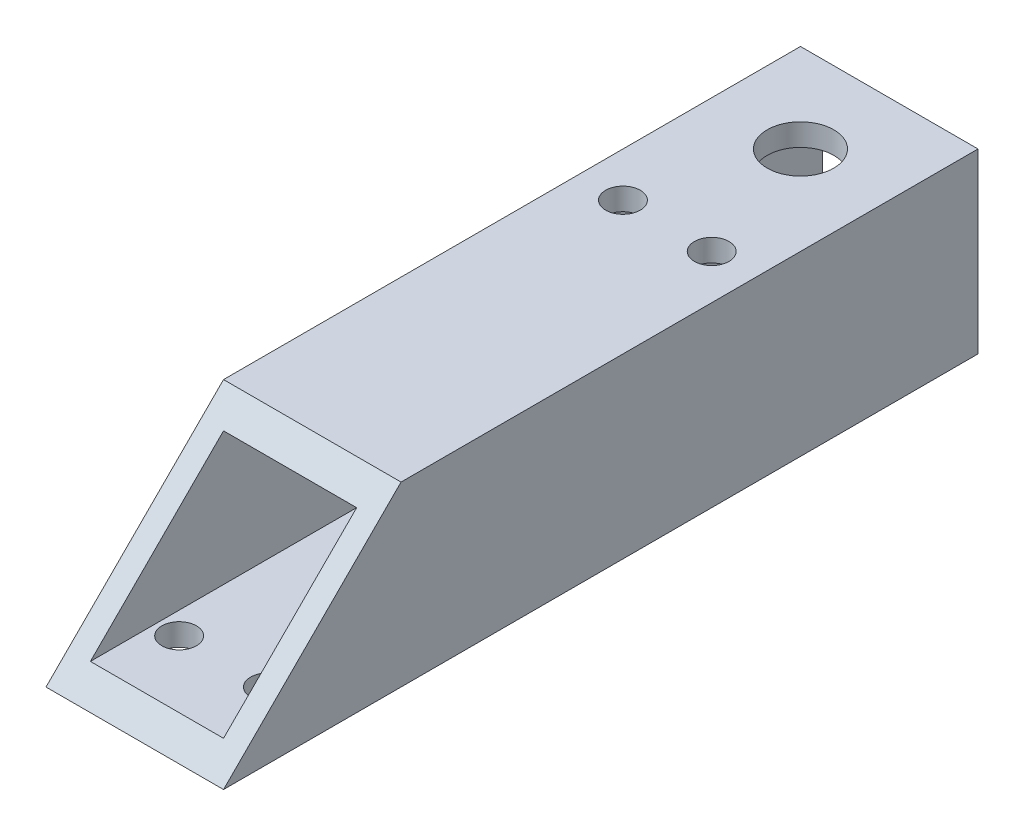
ISO-10303-21;
HEADER;
FILE_DESCRIPTION(('STEP AP214'),'2;1');
FILE_NAME('part.step','',(''),(''),'','','');
FILE_SCHEMA(('AUTOMOTIVE_DESIGN { 1 0 10303 214 1 1 1 1 }'));
ENDSEC;
DATA;
#1=APPLICATION_CONTEXT('core data for automotive mechanical design processes');
#2=APPLICATION_PROTOCOL_DEFINITION('international standard','automotive_design',2000,#1);
#3=PRODUCT_CONTEXT('',#1,'mechanical');
#4=PRODUCT('Part','Part','',(#3));
#5=PRODUCT_RELATED_PRODUCT_CATEGORY('part','',(#4));
#6=PRODUCT_DEFINITION_FORMATION('','',#4);
#7=PRODUCT_DEFINITION_CONTEXT('part definition',#1,'design');
#8=PRODUCT_DEFINITION('design','',#6,#7);
#9=PRODUCT_DEFINITION_SHAPE('','',#8);
#10=(LENGTH_UNIT() NAMED_UNIT(*) SI_UNIT(.MILLI.,.METRE.));
#11=(NAMED_UNIT(*) PLANE_ANGLE_UNIT() SI_UNIT($,.RADIAN.));
#12=(NAMED_UNIT(*) SI_UNIT($,.STERADIAN.) SOLID_ANGLE_UNIT());
#13=UNCERTAINTY_MEASURE_WITH_UNIT(LENGTH_MEASURE(1.E-05),#10,'distance_accuracy_value','');
#14=(GEOMETRIC_REPRESENTATION_CONTEXT(3) GLOBAL_UNCERTAINTY_ASSIGNED_CONTEXT((#13)) GLOBAL_UNIT_ASSIGNED_CONTEXT((#10,
#11,#12)) REPRESENTATION_CONTEXT('',''));
#15=CARTESIAN_POINT('',(0.,0.,0.));
#16=DIRECTION('',(0.,0.,1.));
#17=DIRECTION('',(1.,0.,0.));
#18=AXIS2_PLACEMENT_3D('',#15,#16,#17);
#19=CARTESIAN_POINT('',(-12.7,12.7,107.95));
#20=DIRECTION('',(0.,1.,0.));
#21=DIRECTION('',(0.,0.,1.));
#22=AXIS2_PLACEMENT_3D('',#19,#20,#21);
#23=PLANE('',#22);
#24=CARTESIAN_POINT('',(6.35,12.7,31.75));
#25=DIRECTION('',(0.,-1.,0.));
#26=DIRECTION('',(0.,0.,-1.));
#27=AXIS2_PLACEMENT_3D('',#24,#25,#26);
#28=CIRCLE('',#27,2.47650000000001);
#29=CARTESIAN_POINT('',(6.35,12.7,29.2735));
#30=VERTEX_POINT('',#29);
#31=EDGE_CURVE('E162',#30,#30,#28,.T.);
#32=ORIENTED_EDGE('',*,*,#31,.T.);
#33=EDGE_LOOP('',(#32));
#34=FACE_BOUND('',#33,.T.);
#35=CARTESIAN_POINT('',(-6.35,12.7,31.75));
#36=DIRECTION('',(0.,-1.,0.));
#37=DIRECTION('',(0.,0.,-1.));
#38=AXIS2_PLACEMENT_3D('',#35,#36,#37);
#39=CIRCLE('',#38,2.4765);
#40=CARTESIAN_POINT('',(-6.35,12.7,29.2735));
#41=VERTEX_POINT('',#40);
#42=EDGE_CURVE('E176',#41,#41,#39,.T.);
#43=ORIENTED_EDGE('',*,*,#42,.T.);
#44=EDGE_LOOP('',(#43));
#45=FACE_BOUND('',#44,.T.);
#46=CARTESIAN_POINT('',(0.,12.7,12.7));
#47=DIRECTION('',(0.,1.,0.));
#48=DIRECTION('',(0.,0.,1.));
#49=AXIS2_PLACEMENT_3D('',#46,#47,#48);
#50=CIRCLE('',#49,4.7625);
#51=CARTESIAN_POINT('',(0.,12.7,17.4625));
#52=VERTEX_POINT('',#51);
#53=EDGE_CURVE('E190',#52,#52,#50,.T.);
#54=ORIENTED_EDGE('',*,*,#53,.F.);
#55=EDGE_LOOP('',(#54));
#56=FACE_BOUND('',#55,.T.);
#57=DIRECTION('',(1.,0.,0.));
#58=VECTOR('',#57,1.);
#59=CARTESIAN_POINT('',(-12.7,12.7,82.55));
#60=LINE('',#59,#58);
#61=CARTESIAN_POINT('',(-12.7,12.7,82.55));
#62=VERTEX_POINT('',#61);
#63=CARTESIAN_POINT('',(12.7,12.7,82.55));
#64=VERTEX_POINT('',#63);
#65=EDGE_CURVE('E105',#62,#64,#60,.T.);
#66=ORIENTED_EDGE('',*,*,#65,.T.);
#67=DIRECTION('',(0.,0.,-1.));
#68=VECTOR('',#67,1.);
#69=CARTESIAN_POINT('',(12.7,12.7,107.95));
#70=LINE('',#69,#68);
#71=CARTESIAN_POINT('',(12.7,12.7,0.));
#72=VERTEX_POINT('',#71);
#73=EDGE_CURVE('E140',#64,#72,#70,.T.);
#74=ORIENTED_EDGE('',*,*,#73,.T.);
#75=DIRECTION('',(1.,0.,0.));
#76=VECTOR('',#75,1.);
#77=CARTESIAN_POINT('',(-12.7,12.7,0.));
#78=LINE('',#77,#76);
#79=CARTESIAN_POINT('',(-12.7,12.7,0.));
#80=VERTEX_POINT('',#79);
#81=EDGE_CURVE('E126',#80,#72,#78,.T.);
#82=ORIENTED_EDGE('',*,*,#81,.F.);
#83=DIRECTION('',(0.,0.,-1.));
#84=VECTOR('',#83,1.);
#85=CARTESIAN_POINT('',(-12.7,12.7,107.95));
#86=LINE('',#85,#84);
#87=EDGE_CURVE('E48',#62,#80,#86,.T.);
#88=ORIENTED_EDGE('',*,*,#87,.F.);
#89=EDGE_LOOP('',(#66,#74,#82,#88));
#90=FACE_BOUND('',#89,.T.);
#91=ADVANCED_FACE('F39',(#34,#45,#56,#90),#23,.T.);
#92=CARTESIAN_POINT('',(-12.7,-12.7,107.95));
#93=DIRECTION('',(-1.,0.,0.));
#94=DIRECTION('',(0.,0.,1.));
#95=AXIS2_PLACEMENT_3D('',#92,#93,#94);
#96=PLANE('',#95);
#97=DIRECTION('',(0.,0.707106781186547,-0.707106781186548));
#98=VECTOR('',#97,1.);
#99=CARTESIAN_POINT('',(-12.7,12.7,82.55));
#100=LINE('',#99,#98);
#101=CARTESIAN_POINT('',(-12.7,-12.7,107.95));
#102=VERTEX_POINT('',#101);
#103=EDGE_CURVE('E108',#102,#62,#100,.T.);
#104=ORIENTED_EDGE('',*,*,#103,.T.);
#105=ORIENTED_EDGE('',*,*,#87,.T.);
#106=DIRECTION('',(0.,1.,0.));
#107=VECTOR('',#106,1.);
#108=CARTESIAN_POINT('',(-12.7,-12.7,0.));
#109=LINE('',#108,#107);
#110=CARTESIAN_POINT('',(-12.7,-12.7,0.));
#111=VERTEX_POINT('',#110);
#112=EDGE_CURVE('E134',#111,#80,#109,.T.);
#113=ORIENTED_EDGE('',*,*,#112,.F.);
#114=DIRECTION('',(0.,0.,-1.));
#115=VECTOR('',#114,1.);
#116=CARTESIAN_POINT('',(-12.7,-12.7,107.95));
#117=LINE('',#116,#115);
#118=EDGE_CURVE('E121',#102,#111,#117,.T.);
#119=ORIENTED_EDGE('',*,*,#118,.F.);
#120=EDGE_LOOP('',(#104,#105,#113,#119));
#121=FACE_BOUND('',#120,.T.);
#122=ADVANCED_FACE('F118',(#121),#96,.T.);
#123=CARTESIAN_POINT('',(-12.7,-12.7,107.95));
#124=DIRECTION('',(0.,1.,0.));
#125=DIRECTION('',(0.,0.,1.));
#126=AXIS2_PLACEMENT_3D('',#123,#124,#125);
#127=PLANE('',#126);
#128=CARTESIAN_POINT('',(6.35,-12.7,31.75));
#129=DIRECTION('',(0.,-1.,0.));
#130=DIRECTION('',(0.,0.,-1.));
#131=AXIS2_PLACEMENT_3D('',#128,#129,#130);
#132=CIRCLE('',#131,2.47650000000001);
#133=CARTESIAN_POINT('',(6.35,-12.7,29.2735));
#134=VERTEX_POINT('',#133);
#135=EDGE_CURVE('E170',#134,#134,#132,.T.);
#136=ORIENTED_EDGE('',*,*,#135,.F.);
#137=EDGE_LOOP('',(#136));
#138=FACE_BOUND('',#137,.T.);
#139=CARTESIAN_POINT('',(-6.35,-12.7,31.75));
#140=DIRECTION('',(0.,-1.,0.));
#141=DIRECTION('',(0.,0.,-1.));
#142=AXIS2_PLACEMENT_3D('',#139,#140,#141);
#143=CIRCLE('',#142,2.4765);
#144=CARTESIAN_POINT('',(-6.35,-12.7,29.2735));
#145=VERTEX_POINT('',#144);
#146=EDGE_CURVE('E182',#145,#145,#143,.T.);
#147=ORIENTED_EDGE('',*,*,#146,.F.);
#148=EDGE_LOOP('',(#147));
#149=FACE_BOUND('',#148,.T.);
#150=CARTESIAN_POINT('',(0.,-12.7,12.7));
#151=DIRECTION('',(0.,1.,0.));
#152=DIRECTION('',(0.,0.,1.));
#153=AXIS2_PLACEMENT_3D('',#150,#151,#152);
#154=CIRCLE('',#153,4.7625);
#155=CARTESIAN_POINT('',(0.,-12.7,17.4625));
#156=VERTEX_POINT('',#155);
#157=EDGE_CURVE('E157',#156,#156,#154,.T.);
#158=ORIENTED_EDGE('',*,*,#157,.T.);
#159=EDGE_LOOP('',(#158));
#160=FACE_BOUND('',#159,.T.);
#161=CARTESIAN_POINT('',(-6.35,-12.7,95.25));
#162=DIRECTION('',(0.,-1.,0.));
#163=DIRECTION('',(0.,0.,-1.));
#164=AXIS2_PLACEMENT_3D('',#161,#162,#163);
#165=CIRCLE('',#164,2.4765);
#166=CARTESIAN_POINT('',(-6.35,-12.7,92.7735));
#167=VERTEX_POINT('',#166);
#168=EDGE_CURVE('E149',#167,#167,#165,.T.);
#169=ORIENTED_EDGE('',*,*,#168,.F.);
#170=EDGE_LOOP('',(#169));
#171=FACE_BOUND('',#170,.T.);
#172=CARTESIAN_POINT('',(6.35,-12.7,95.25));
#173=DIRECTION('',(0.,-1.,0.));
#174=DIRECTION('',(0.,0.,1.));
#175=AXIS2_PLACEMENT_3D('',#172,#173,#174);
#176=CIRCLE('',#175,2.4765);
#177=CARTESIAN_POINT('',(6.35,-12.7,97.7265));
#178=VERTEX_POINT('',#177);
#179=EDGE_CURVE('E200',#178,#178,#176,.T.);
#180=ORIENTED_EDGE('',*,*,#179,.F.);
#181=EDGE_LOOP('',(#180));
#182=FACE_BOUND('',#181,.T.);
#183=DIRECTION('',(1.,0.,0.));
#184=VECTOR('',#183,1.);
#185=CARTESIAN_POINT('',(-12.7,-12.7,0.));
#186=LINE('',#185,#184);
#187=CARTESIAN_POINT('',(12.7,-12.7,0.));
#188=VERTEX_POINT('',#187);
#189=EDGE_CURVE('E255',#111,#188,#186,.T.);
#190=ORIENTED_EDGE('',*,*,#189,.T.);
#191=DIRECTION('',(0.,0.,-1.));
#192=VECTOR('',#191,1.);
#193=CARTESIAN_POINT('',(12.7,-12.7,107.95));
#194=LINE('',#193,#192);
#195=CARTESIAN_POINT('',(12.7,-12.7,107.95));
#196=VERTEX_POINT('',#195);
#197=EDGE_CURVE('E131',#196,#188,#194,.T.);
#198=ORIENTED_EDGE('',*,*,#197,.F.);
#199=DIRECTION('',(1.,0.,0.));
#200=VECTOR('',#199,1.);
#201=CARTESIAN_POINT('',(-12.7,-12.7,107.95));
#202=LINE('',#201,#200);
#203=EDGE_CURVE('E142',#102,#196,#202,.T.);
#204=ORIENTED_EDGE('',*,*,#203,.F.);
#205=ORIENTED_EDGE('',*,*,#118,.T.);
#206=EDGE_LOOP('',(#190,#198,#204,#205));
#207=FACE_BOUND('',#206,.T.);
#208=ADVANCED_FACE('F266',(#138,#149,#160,#171,#182,#207),#127,.F.);
#209=CARTESIAN_POINT('',(12.7,-12.7,107.95));
#210=DIRECTION('',(-1.,0.,0.));
#211=DIRECTION('',(0.,0.,1.));
#212=AXIS2_PLACEMENT_3D('',#209,#210,#211);
#213=PLANE('',#212);
#214=ORIENTED_EDGE('',*,*,#73,.F.);
#215=DIRECTION('',(0.,0.707106781186547,-0.707106781186548));
#216=VECTOR('',#215,1.);
#217=CARTESIAN_POINT('',(12.7,12.7,82.55));
#218=LINE('',#217,#216);
#219=EDGE_CURVE('E111',#196,#64,#218,.T.);
#220=ORIENTED_EDGE('',*,*,#219,.F.);
#221=ORIENTED_EDGE('',*,*,#197,.T.);
#222=DIRECTION('',(0.,1.,0.));
#223=VECTOR('',#222,1.);
#224=CARTESIAN_POINT('',(12.7,-12.7,0.));
#225=LINE('',#224,#223);
#226=EDGE_CURVE('E252',#188,#72,#225,.T.);
#227=ORIENTED_EDGE('',*,*,#226,.T.);
#228=EDGE_LOOP('',(#214,#220,#221,#227));
#229=FACE_BOUND('',#228,.T.);
#230=ADVANCED_FACE('F265',(#229),#213,.F.);
#231=CARTESIAN_POINT('',(0.,0.,0.));
#232=DIRECTION('',(0.,0.,1.));
#233=DIRECTION('',(1.,0.,0.));
#234=AXIS2_PLACEMENT_3D('',#231,#232,#233);
#235=PLANE('',#234);
#236=DIRECTION('',(1.,0.,0.));
#237=VECTOR('',#236,1.);
#238=CARTESIAN_POINT('',(-9.525,-9.525,0.));
#239=LINE('',#238,#237);
#240=CARTESIAN_POINT('',(-9.525,-9.525,0.));
#241=VERTEX_POINT('',#240);
#242=CARTESIAN_POINT('',(9.525,-9.525,0.));
#243=VERTEX_POINT('',#242);
#244=EDGE_CURVE('E229',#241,#243,#239,.T.);
#245=ORIENTED_EDGE('',*,*,#244,.T.);
#246=DIRECTION('',(0.,1.,0.));
#247=VECTOR('',#246,1.);
#248=CARTESIAN_POINT('',(9.525,-9.525,0.));
#249=LINE('',#248,#247);
#250=CARTESIAN_POINT('',(9.525,9.525,0.));
#251=VERTEX_POINT('',#250);
#252=EDGE_CURVE('E219',#243,#251,#249,.T.);
#253=ORIENTED_EDGE('',*,*,#252,.T.);
#254=DIRECTION('',(-1.,0.,0.));
#255=VECTOR('',#254,1.);
#256=CARTESIAN_POINT('',(-9.525,9.525,0.));
#257=LINE('',#256,#255);
#258=CARTESIAN_POINT('',(-9.525,9.525,0.));
#259=VERTEX_POINT('',#258);
#260=EDGE_CURVE('E223',#251,#259,#257,.T.);
#261=ORIENTED_EDGE('',*,*,#260,.T.);
#262=DIRECTION('',(0.,-1.,0.));
#263=VECTOR('',#262,1.);
#264=CARTESIAN_POINT('',(-9.525,-9.525,0.));
#265=LINE('',#264,#263);
#266=EDGE_CURVE('E63',#259,#241,#265,.T.);
#267=ORIENTED_EDGE('',*,*,#266,.T.);
#268=EDGE_LOOP('',(#245,#253,#261,#267));
#269=FACE_BOUND('',#268,.T.);
#270=ORIENTED_EDGE('',*,*,#81,.T.);
#271=ORIENTED_EDGE('',*,*,#226,.F.);
#272=ORIENTED_EDGE('',*,*,#189,.F.);
#273=ORIENTED_EDGE('',*,*,#112,.T.);
#274=EDGE_LOOP('',(#270,#271,#272,#273));
#275=FACE_BOUND('',#274,.T.);
#276=ADVANCED_FACE('F262',(#269,#275),#235,.F.);
#277=CARTESIAN_POINT('',(9.525,-9.525,0.));
#278=DIRECTION('',(1.,0.,0.));
#279=DIRECTION('',(0.,0.,-1.));
#280=AXIS2_PLACEMENT_3D('',#277,#278,#279);
#281=PLANE('',#280);
#282=DIRECTION('',(0.,0.,1.));
#283=VECTOR('',#282,1.);
#284=CARTESIAN_POINT('',(9.525,-9.525,0.));
#285=LINE('',#284,#283);
#286=CARTESIAN_POINT('',(9.525,-9.525,104.775));
#287=VERTEX_POINT('',#286);
#288=EDGE_CURVE('E234',#243,#287,#285,.T.);
#289=ORIENTED_EDGE('',*,*,#288,.T.);
#290=DIRECTION('',(0.,0.707106781186547,-0.707106781186548));
#291=VECTOR('',#290,1.);
#292=CARTESIAN_POINT('',(9.525,42.8625,52.3875));
#293=LINE('',#292,#291);
#294=CARTESIAN_POINT('',(9.525,9.525,85.725));
#295=VERTEX_POINT('',#294);
#296=EDGE_CURVE('E215',#287,#295,#293,.T.);
#297=ORIENTED_EDGE('',*,*,#296,.T.);
#298=DIRECTION('',(0.,0.,1.));
#299=VECTOR('',#298,1.);
#300=CARTESIAN_POINT('',(9.525,9.525,0.));
#301=LINE('',#300,#299);
#302=EDGE_CURVE('E233',#251,#295,#301,.T.);
#303=ORIENTED_EDGE('',*,*,#302,.F.);
#304=ORIENTED_EDGE('',*,*,#252,.F.);
#305=EDGE_LOOP('',(#289,#297,#303,#304));
#306=FACE_BOUND('',#305,.T.);
#307=ADVANCED_FACE('F302',(#306),#281,.F.);
#308=CARTESIAN_POINT('',(-9.525,-9.525,0.));
#309=DIRECTION('',(0.,-1.,0.));
#310=DIRECTION('',(0.,0.,-1.));
#311=AXIS2_PLACEMENT_3D('',#308,#309,#310);
#312=PLANE('',#311);
#313=CARTESIAN_POINT('',(6.35,-9.525,31.75));
#314=DIRECTION('',(0.,-1.,0.));
#315=DIRECTION('',(0.,0.,-1.));
#316=AXIS2_PLACEMENT_3D('',#313,#314,#315);
#317=CIRCLE('',#316,2.47650000000001);
#318=CARTESIAN_POINT('',(6.35,-9.525,29.2735));
#319=VERTEX_POINT('',#318);
#320=EDGE_CURVE('E186',#319,#319,#317,.T.);
#321=ORIENTED_EDGE('',*,*,#320,.T.);
#322=EDGE_LOOP('',(#321));
#323=FACE_BOUND('',#322,.T.);
#324=CARTESIAN_POINT('',(-6.35,-9.525,31.75));
#325=DIRECTION('',(0.,-1.,0.));
#326=DIRECTION('',(0.,0.,-1.));
#327=AXIS2_PLACEMENT_3D('',#324,#325,#326);
#328=CIRCLE('',#327,2.4765);
#329=CARTESIAN_POINT('',(-6.35,-9.525,29.2735));
#330=VERTEX_POINT('',#329);
#331=EDGE_CURVE('E161',#330,#330,#328,.T.);
#332=ORIENTED_EDGE('',*,*,#331,.T.);
#333=EDGE_LOOP('',(#332));
#334=FACE_BOUND('',#333,.T.);
#335=CARTESIAN_POINT('',(0.,-9.525,12.7));
#336=DIRECTION('',(0.,-1.,0.));
#337=DIRECTION('',(0.,0.,-1.));
#338=AXIS2_PLACEMENT_3D('',#335,#336,#337);
#339=CIRCLE('',#338,4.7625);
#340=CARTESIAN_POINT('',(0.,-9.525,7.9375));
#341=VERTEX_POINT('',#340);
#342=EDGE_CURVE('E156',#341,#341,#339,.T.);
#343=ORIENTED_EDGE('',*,*,#342,.T.);
#344=EDGE_LOOP('',(#343));
#345=FACE_BOUND('',#344,.T.);
#346=CARTESIAN_POINT('',(-6.35,-9.525,95.25));
#347=DIRECTION('',(0.,-1.,0.));
#348=DIRECTION('',(0.,0.,-1.));
#349=AXIS2_PLACEMENT_3D('',#346,#347,#348);
#350=CIRCLE('',#349,2.4765);
#351=CARTESIAN_POINT('',(-6.35,-9.525,92.7735));
#352=VERTEX_POINT('',#351);
#353=EDGE_CURVE('E148',#352,#352,#350,.T.);
#354=ORIENTED_EDGE('',*,*,#353,.T.);
#355=EDGE_LOOP('',(#354));
#356=FACE_BOUND('',#355,.T.);
#357=CARTESIAN_POINT('',(6.35,-9.525,95.25));
#358=DIRECTION('',(0.,-1.,0.));
#359=DIRECTION('',(0.,0.,-1.));
#360=AXIS2_PLACEMENT_3D('',#357,#358,#359);
#361=CIRCLE('',#360,2.4765);
#362=CARTESIAN_POINT('',(6.35,-9.525,92.7735));
#363=VERTEX_POINT('',#362);
#364=EDGE_CURVE('E144',#363,#363,#361,.T.);
#365=ORIENTED_EDGE('',*,*,#364,.T.);
#366=EDGE_LOOP('',(#365));
#367=FACE_BOUND('',#366,.T.);
#368=DIRECTION('',(0.,0.,1.));
#369=VECTOR('',#368,1.);
#370=CARTESIAN_POINT('',(-9.525,-9.525,0.));
#371=LINE('',#370,#369);
#372=CARTESIAN_POINT('',(-9.525,-9.525,104.775));
#373=VERTEX_POINT('',#372);
#374=EDGE_CURVE('E238',#241,#373,#371,.T.);
#375=ORIENTED_EDGE('',*,*,#374,.T.);
#376=DIRECTION('',(1.,0.,0.));
#377=VECTOR('',#376,1.);
#378=CARTESIAN_POINT('',(-9.525,-9.525,104.775));
#379=LINE('',#378,#377);
#380=EDGE_CURVE('E211',#373,#287,#379,.T.);
#381=ORIENTED_EDGE('',*,*,#380,.T.);
#382=ORIENTED_EDGE('',*,*,#288,.F.);
#383=ORIENTED_EDGE('',*,*,#244,.F.);
#384=EDGE_LOOP('',(#375,#381,#382,#383));
#385=FACE_BOUND('',#384,.T.);
#386=ADVANCED_FACE('F304',(#323,#334,#345,#356,#367,#385),#312,.F.);
#387=CARTESIAN_POINT('',(-9.525,-9.525,0.));
#388=DIRECTION('',(-1.,0.,0.));
#389=DIRECTION('',(0.,0.,1.));
#390=AXIS2_PLACEMENT_3D('',#387,#388,#389);
#391=PLANE('',#390);
#392=DIRECTION('',(0.,0.,1.));
#393=VECTOR('',#392,1.);
#394=CARTESIAN_POINT('',(-9.525,9.525,0.));
#395=LINE('',#394,#393);
#396=CARTESIAN_POINT('',(-9.525,9.525,85.725));
#397=VERTEX_POINT('',#396);
#398=EDGE_CURVE('E242',#259,#397,#395,.T.);
#399=ORIENTED_EDGE('',*,*,#398,.T.);
#400=DIRECTION('',(0.,-0.707106781186547,0.707106781186548));
#401=VECTOR('',#400,1.);
#402=CARTESIAN_POINT('',(-9.525,42.8625,52.3875));
#403=LINE('',#402,#401);
#404=EDGE_CURVE('E56',#397,#373,#403,.T.);
#405=ORIENTED_EDGE('',*,*,#404,.T.);
#406=ORIENTED_EDGE('',*,*,#374,.F.);
#407=ORIENTED_EDGE('',*,*,#266,.F.);
#408=EDGE_LOOP('',(#399,#405,#406,#407));
#409=FACE_BOUND('',#408,.T.);
#410=ADVANCED_FACE('F296',(#409),#391,.F.);
#411=CARTESIAN_POINT('',(-9.525,9.525,0.));
#412=DIRECTION('',(0.,1.,0.));
#413=DIRECTION('',(0.,0.,1.));
#414=AXIS2_PLACEMENT_3D('',#411,#412,#413);
#415=PLANE('',#414);
#416=CARTESIAN_POINT('',(6.35,9.525,31.75));
#417=DIRECTION('',(0.,1.,0.));
#418=DIRECTION('',(0.,0.,1.));
#419=AXIS2_PLACEMENT_3D('',#416,#417,#418);
#420=CIRCLE('',#419,2.47650000000001);
#421=CARTESIAN_POINT('',(6.35,9.525,34.2265));
#422=VERTEX_POINT('',#421);
#423=EDGE_CURVE('E42',#422,#422,#420,.T.);
#424=ORIENTED_EDGE('',*,*,#423,.T.);
#425=EDGE_LOOP('',(#424));
#426=FACE_BOUND('',#425,.T.);
#427=CARTESIAN_POINT('',(-6.35,9.525,31.75));
#428=DIRECTION('',(0.,1.,0.));
#429=DIRECTION('',(0.,0.,1.));
#430=AXIS2_PLACEMENT_3D('',#427,#428,#429);
#431=CIRCLE('',#430,2.4765);
#432=CARTESIAN_POINT('',(-6.35,9.525,34.2265));
#433=VERTEX_POINT('',#432);
#434=EDGE_CURVE('E158',#433,#433,#431,.T.);
#435=ORIENTED_EDGE('',*,*,#434,.T.);
#436=EDGE_LOOP('',(#435));
#437=FACE_BOUND('',#436,.T.);
#438=CARTESIAN_POINT('',(0.,9.525,12.7));
#439=DIRECTION('',(0.,1.,0.));
#440=DIRECTION('',(0.,0.,1.));
#441=AXIS2_PLACEMENT_3D('',#438,#439,#440);
#442=CIRCLE('',#441,4.7625);
#443=CARTESIAN_POINT('',(0.,9.525,17.4625));
#444=VERTEX_POINT('',#443);
#445=EDGE_CURVE('E153',#444,#444,#442,.T.);
#446=ORIENTED_EDGE('',*,*,#445,.T.);
#447=EDGE_LOOP('',(#446));
#448=FACE_BOUND('',#447,.T.);
#449=ORIENTED_EDGE('',*,*,#302,.T.);
#450=DIRECTION('',(-1.,0.,0.));
#451=VECTOR('',#450,1.);
#452=CARTESIAN_POINT('',(-9.525,9.525,85.725));
#453=LINE('',#452,#451);
#454=EDGE_CURVE('E11',#295,#397,#453,.T.);
#455=ORIENTED_EDGE('',*,*,#454,.T.);
#456=ORIENTED_EDGE('',*,*,#398,.F.);
#457=ORIENTED_EDGE('',*,*,#260,.F.);
#458=EDGE_LOOP('',(#449,#455,#456,#457));
#459=FACE_BOUND('',#458,.T.);
#460=ADVANCED_FACE('F293',(#426,#437,#448,#459),#415,.F.);
#461=CARTESIAN_POINT('',(-12.7,12.7,82.55));
#462=DIRECTION('',(0.,-0.707106781186548,-0.707106781186547));
#463=DIRECTION('',(0.,0.707106781186547,-0.707106781186548));
#464=AXIS2_PLACEMENT_3D('',#461,#462,#463);
#465=PLANE('',#464);
#466=ORIENTED_EDGE('',*,*,#219,.T.);
#467=ORIENTED_EDGE('',*,*,#65,.F.);
#468=ORIENTED_EDGE('',*,*,#103,.F.);
#469=ORIENTED_EDGE('',*,*,#203,.T.);
#470=EDGE_LOOP('',(#466,#467,#468,#469));
#471=FACE_BOUND('',#470,.T.);
#472=ORIENTED_EDGE('',*,*,#380,.F.);
#473=ORIENTED_EDGE('',*,*,#404,.F.);
#474=ORIENTED_EDGE('',*,*,#454,.F.);
#475=ORIENTED_EDGE('',*,*,#296,.F.);
#476=EDGE_LOOP('',(#472,#473,#474,#475));
#477=FACE_BOUND('',#476,.T.);
#478=ADVANCED_FACE('F107',(#471,#477),#465,.F.);
#479=CARTESIAN_POINT('',(6.35,12.7,95.25));
#480=DIRECTION('',(0.,-1.,0.));
#481=DIRECTION('',(0.,0.,-1.));
#482=AXIS2_PLACEMENT_3D('',#479,#480,#481);
#483=CYLINDRICAL_SURFACE('',#482,2.4765);
#484=ORIENTED_EDGE('',*,*,#179,.T.);
#485=EDGE_LOOP('',(#484));
#486=FACE_BOUND('',#485,.T.);
#487=ORIENTED_EDGE('',*,*,#364,.F.);
#488=EDGE_LOOP('',(#487));
#489=FACE_BOUND('',#488,.T.);
#490=ADVANCED_FACE('F321',(#486,#489),#483,.F.);
#491=CARTESIAN_POINT('',(-6.35,12.7,95.25));
#492=DIRECTION('',(0.,-1.,0.));
#493=DIRECTION('',(0.,0.,-1.));
#494=AXIS2_PLACEMENT_3D('',#491,#492,#493);
#495=CYLINDRICAL_SURFACE('',#494,2.4765);
#496=ORIENTED_EDGE('',*,*,#168,.T.);
#497=EDGE_LOOP('',(#496));
#498=FACE_BOUND('',#497,.T.);
#499=ORIENTED_EDGE('',*,*,#353,.F.);
#500=EDGE_LOOP('',(#499));
#501=FACE_BOUND('',#500,.T.);
#502=ADVANCED_FACE('F289',(#498,#501),#495,.F.);
#503=CARTESIAN_POINT('',(0.,-12.7,12.7));
#504=DIRECTION('',(0.,1.,0.));
#505=DIRECTION('',(0.,0.,1.));
#506=AXIS2_PLACEMENT_3D('',#503,#504,#505);
#507=CYLINDRICAL_SURFACE('',#506,4.7625);
#508=ORIENTED_EDGE('',*,*,#53,.T.);
#509=EDGE_LOOP('',(#508));
#510=FACE_BOUND('',#509,.T.);
#511=ORIENTED_EDGE('',*,*,#445,.F.);
#512=EDGE_LOOP('',(#511));
#513=FACE_BOUND('',#512,.T.);
#514=ADVANCED_FACE('F285',(#510,#513),#507,.F.);
#515=ORIENTED_EDGE('',*,*,#157,.F.);
#516=EDGE_LOOP('',(#515));
#517=FACE_BOUND('',#516,.T.);
#518=ORIENTED_EDGE('',*,*,#342,.F.);
#519=EDGE_LOOP('',(#518));
#520=FACE_BOUND('',#519,.T.);
#521=ADVANCED_FACE('F288',(#517,#520),#507,.F.);
#522=CARTESIAN_POINT('',(-6.35,12.7,31.75));
#523=DIRECTION('',(0.,-1.,0.));
#524=DIRECTION('',(0.,0.,-1.));
#525=AXIS2_PLACEMENT_3D('',#522,#523,#524);
#526=CYLINDRICAL_SURFACE('',#525,2.4765);
#527=ORIENTED_EDGE('',*,*,#42,.F.);
#528=EDGE_LOOP('',(#527));
#529=FACE_BOUND('',#528,.T.);
#530=ORIENTED_EDGE('',*,*,#434,.F.);
#531=EDGE_LOOP('',(#530));
#532=FACE_BOUND('',#531,.T.);
#533=ADVANCED_FACE('F329',(#529,#532),#526,.F.);
#534=CARTESIAN_POINT('',(6.35,12.7,31.75));
#535=DIRECTION('',(0.,-1.,0.));
#536=DIRECTION('',(0.,0.,-1.));
#537=AXIS2_PLACEMENT_3D('',#534,#535,#536);
#538=CYLINDRICAL_SURFACE('',#537,2.47650000000001);
#539=ORIENTED_EDGE('',*,*,#31,.F.);
#540=EDGE_LOOP('',(#539));
#541=FACE_BOUND('',#540,.T.);
#542=ORIENTED_EDGE('',*,*,#423,.F.);
#543=EDGE_LOOP('',(#542));
#544=FACE_BOUND('',#543,.T.);
#545=ADVANCED_FACE('F335',(#541,#544),#538,.F.);
#546=ORIENTED_EDGE('',*,*,#146,.T.);
#547=EDGE_LOOP('',(#546));
#548=FACE_BOUND('',#547,.T.);
#549=ORIENTED_EDGE('',*,*,#331,.F.);
#550=EDGE_LOOP('',(#549));
#551=FACE_BOUND('',#550,.T.);
#552=ADVANCED_FACE('F331',(#548,#551),#526,.F.);
#553=ORIENTED_EDGE('',*,*,#135,.T.);
#554=EDGE_LOOP('',(#553));
#555=FACE_BOUND('',#554,.T.);
#556=ORIENTED_EDGE('',*,*,#320,.F.);
#557=EDGE_LOOP('',(#556));
#558=FACE_BOUND('',#557,.T.);
#559=ADVANCED_FACE('F334',(#555,#558),#538,.F.);
#560=CLOSED_SHELL('',(#91,#122,#208,#230,#276,#307,#386,#410,#460,#478,#490,#502,#514,#521,#533,
#545,#552,#559));
#561=MANIFOLD_SOLID_BREP('B2',#560);
#562=ADVANCED_BREP_SHAPE_REPRESENTATION('',(#18,#561),#14);
#563=SHAPE_DEFINITION_REPRESENTATION(#9,#562);
ENDSEC;
END-ISO-10303-21;
